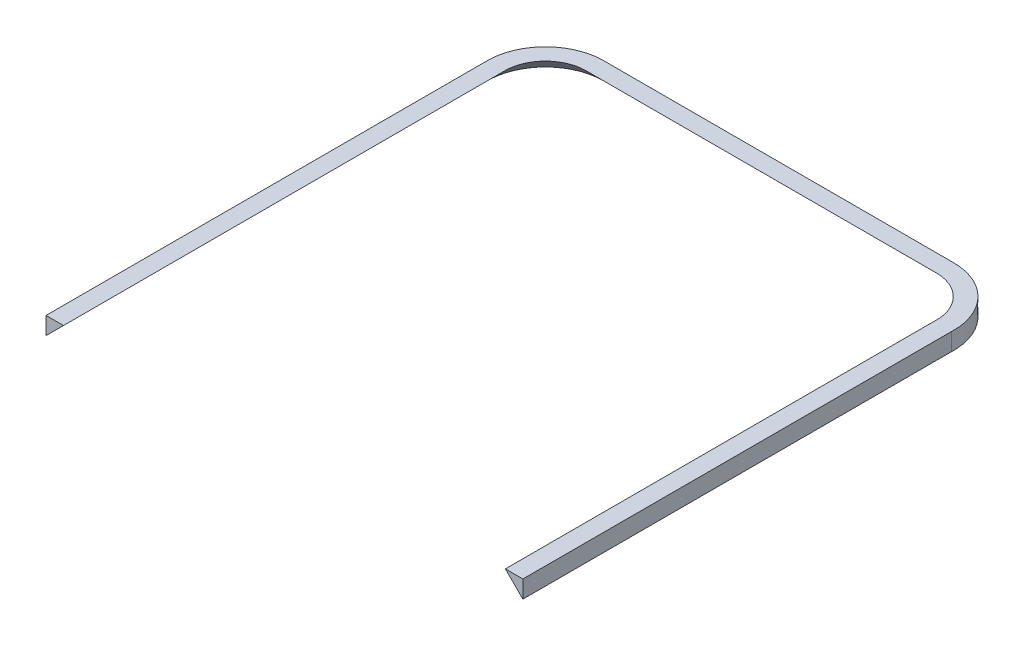
ISO-10303-21;
HEADER;
FILE_DESCRIPTION(('STEP AP214'),'2;1');
FILE_NAME('part.step','',(''),(''),'','','');
FILE_SCHEMA(('AUTOMOTIVE_DESIGN { 1 0 10303 214 1 1 1 1 }'));
ENDSEC;
DATA;
#1=APPLICATION_CONTEXT('core data for automotive mechanical design processes');
#2=APPLICATION_PROTOCOL_DEFINITION('international standard','automotive_design',2000,#1);
#3=PRODUCT_CONTEXT('',#1,'mechanical');
#4=PRODUCT('Part','Part','',(#3));
#5=PRODUCT_RELATED_PRODUCT_CATEGORY('part','',(#4));
#6=PRODUCT_DEFINITION_FORMATION('','',#4);
#7=PRODUCT_DEFINITION_CONTEXT('part definition',#1,'design');
#8=PRODUCT_DEFINITION('design','',#6,#7);
#9=PRODUCT_DEFINITION_SHAPE('','',#8);
#10=(LENGTH_UNIT() NAMED_UNIT(*) SI_UNIT(.MILLI.,.METRE.));
#11=(NAMED_UNIT(*) PLANE_ANGLE_UNIT() SI_UNIT($,.RADIAN.));
#12=(NAMED_UNIT(*) SI_UNIT($,.STERADIAN.) SOLID_ANGLE_UNIT());
#13=UNCERTAINTY_MEASURE_WITH_UNIT(LENGTH_MEASURE(1.E-05),#10,'distance_accuracy_value','');
#14=(GEOMETRIC_REPRESENTATION_CONTEXT(3) GLOBAL_UNCERTAINTY_ASSIGNED_CONTEXT((#13)) GLOBAL_UNIT_ASSIGNED_CONTEXT((#10,
#11,#12)) REPRESENTATION_CONTEXT('',''));
#15=CARTESIAN_POINT('',(0.,0.,0.));
#16=DIRECTION('',(0.,0.,1.));
#17=DIRECTION('',(1.,0.,0.));
#18=AXIS2_PLACEMENT_3D('',#15,#16,#17);
#19=CARTESIAN_POINT('',(60.0000000072265,-140.1,-167.746827861585));
#20=DIRECTION('',(0.,1.52655665885959E-13,-1.));
#21=DIRECTION('',(0.,1.,1.52655665885959E-13));
#22=AXIS2_PLACEMENT_3D('',#19,#20,#21);
#23=PLANE('',#22);
#24=DIRECTION('',(0.,-1.,-1.52655665885959E-13));
#25=VECTOR('',#24,1.);
#26=CARTESIAN_POINT('',(60.0000000072265,-140.1,-167.746827861585));
#27=LINE('',#26,#25);
#28=CARTESIAN_POINT('',(60.0000000072265,-137.1,-167.746827861585));
#29=VERTEX_POINT('',#28);
#30=CARTESIAN_POINT('',(60.0000000072265,-143.1,-167.746827861586));
#31=VERTEX_POINT('',#30);
#32=EDGE_CURVE('E218',#29,#31,#27,.T.);
#33=ORIENTED_EDGE('',*,*,#32,.T.);
#34=DIRECTION('',(-1.,0.,0.));
#35=VECTOR('',#34,1.);
#36=CARTESIAN_POINT('',(60.0000000072265,-143.1,-167.746827861586));
#37=LINE('',#36,#35);
#38=CARTESIAN_POINT('',(-60.0000000072264,-143.1,-167.746827861586));
#39=VERTEX_POINT('',#38);
#40=EDGE_CURVE('E93',#31,#39,#37,.T.);
#41=ORIENTED_EDGE('',*,*,#40,.T.);
#42=DIRECTION('',(0.,-1.,-1.52655665885959E-13));
#43=VECTOR('',#42,1.);
#44=CARTESIAN_POINT('',(-60.0000000072264,-140.1,-167.746827861585));
#45=LINE('',#44,#43);
#46=CARTESIAN_POINT('',(-60.0000000072264,-137.1,-167.746827861585));
#47=VERTEX_POINT('',#46);
#48=EDGE_CURVE('E101',#47,#39,#45,.T.);
#49=ORIENTED_EDGE('',*,*,#48,.F.);
#50=DIRECTION('',(-1.,0.,0.));
#51=VECTOR('',#50,1.);
#52=CARTESIAN_POINT('',(60.0000000072265,-137.1,-167.746827861585));
#53=LINE('',#52,#51);
#54=EDGE_CURVE('E12',#29,#47,#53,.T.);
#55=ORIENTED_EDGE('',*,*,#54,.F.);
#56=EDGE_LOOP('',(#33,#41,#49,#55));
#57=FACE_BOUND('',#56,.T.);
#58=ADVANCED_FACE('F83',(#57),#23,.T.);
#59=CARTESIAN_POINT('',(60.0026904539942,-140.1,-164.746829068003));
#60=DIRECTION('',(0.,-0.707106639008926,0.70710692336414));
#61=DIRECTION('',(0.,-0.70710692336414,-0.707106639008926));
#62=AXIS2_PLACEMENT_3D('',#59,#60,#61);
#63=PLANE('',#62);
#64=DIRECTION('',(0.000634144384634329,0.707106781186455,0.707106496831298));
#65=VECTOR('',#64,1.);
#66=CARTESIAN_POINT('',(60.0026904539942,-140.1,-164.746829068003));
#67=LINE('',#66,#65);
#68=CARTESIAN_POINT('',(60.005380900762,-137.100000000001,-161.74683027442));
#69=VERTEX_POINT('',#68);
#70=EDGE_CURVE('E210',#31,#69,#67,.T.);
#71=ORIENTED_EDGE('',*,*,#70,.T.);
#72=DIRECTION('',(-1.,0.,0.));
#73=VECTOR('',#72,1.);
#74=CARTESIAN_POINT('',(60.005380900762,-137.100000000001,-161.74683027442));
#75=LINE('',#74,#73);
#76=CARTESIAN_POINT('',(-59.9946191136909,-137.100000000001,-161.74683027442));
#77=VERTEX_POINT('',#76);
#78=EDGE_CURVE('E108',#69,#77,#75,.T.);
#79=ORIENTED_EDGE('',*,*,#78,.T.);
#80=DIRECTION('',(0.000634144384634329,0.707106781186455,0.707106496831298));
#81=VECTOR('',#80,1.);
#82=CARTESIAN_POINT('',(-59.9973095604586,-140.1,-164.746829068003));
#83=LINE('',#82,#81);
#84=EDGE_CURVE('E227',#39,#77,#83,.T.);
#85=ORIENTED_EDGE('',*,*,#84,.F.);
#86=ORIENTED_EDGE('',*,*,#40,.F.);
#87=EDGE_LOOP('',(#71,#79,#85,#86));
#88=FACE_BOUND('',#87,.T.);
#89=ADVANCED_FACE('F283',(#88),#63,.T.);
#90=CARTESIAN_POINT('',(0.,0.,0.));
#91=DIRECTION('',(0.,0.,1.));
#92=DIRECTION('',(1.,0.,0.));
#93=AXIS2_PLACEMENT_3D('',#90,#91,#92);
#94=PLANE('',#93);
#95=DIRECTION('',(0.,1.,0.));
#96=VECTOR('',#95,1.);
#97=CARTESIAN_POINT('',(80.0000000000001,-143.1,0.));
#98=LINE('',#97,#96);
#99=CARTESIAN_POINT('',(80.0000000000001,-143.1,0.));
#100=VERTEX_POINT('',#99);
#101=CARTESIAN_POINT('',(80.0000000000001,-137.1,0.));
#102=VERTEX_POINT('',#101);
#103=EDGE_CURVE('E229',#100,#102,#98,.T.);
#104=ORIENTED_EDGE('',*,*,#103,.T.);
#105=DIRECTION('',(-1.,0.,0.));
#106=VECTOR('',#105,1.);
#107=CARTESIAN_POINT('',(80.0000000000001,-137.1,0.));
#108=LINE('',#107,#106);
#109=CARTESIAN_POINT('',(74.0000000000001,-137.1,0.));
#110=VERTEX_POINT('',#109);
#111=EDGE_CURVE('E232',#102,#110,#108,.T.);
#112=ORIENTED_EDGE('',*,*,#111,.T.);
#113=DIRECTION('',(0.707106781186549,-0.707106781186546,0.));
#114=VECTOR('',#113,1.);
#115=CARTESIAN_POINT('',(74.0000000000001,-137.1,0.));
#116=LINE('',#115,#114);
#117=EDGE_CURVE('E236',#110,#100,#116,.T.);
#118=ORIENTED_EDGE('',*,*,#117,.T.);
#119=EDGE_LOOP('',(#104,#112,#118));
#120=FACE_BOUND('',#119,.T.);
#121=ADVANCED_FACE('F274',(#120),#94,.T.);
#122=CARTESIAN_POINT('',(80.0000000000001,-143.1,-155.44882255944));
#123=DIRECTION('',(1.,0.,0.));
#124=DIRECTION('',(0.,0.,-1.));
#125=AXIS2_PLACEMENT_3D('',#122,#123,#124);
#126=PLANE('',#125);
#127=DIRECTION('',(0.,0.,1.));
#128=VECTOR('',#127,1.);
#129=CARTESIAN_POINT('',(80.0000000000001,-143.1,-155.44882255944));
#130=LINE('',#129,#128);
#131=CARTESIAN_POINT('',(80.,-143.1,-146.9));
#132=VERTEX_POINT('',#131);
#133=EDGE_CURVE('E240',#132,#100,#130,.T.);
#134=ORIENTED_EDGE('',*,*,#133,.F.);
#135=DIRECTION('',(0.,1.,0.));
#136=VECTOR('',#135,1.);
#137=CARTESIAN_POINT('',(80.0000000000001,-143.1,-146.9));
#138=LINE('',#137,#136);
#139=CARTESIAN_POINT('',(80.0000000000001,-137.1,-146.9));
#140=VERTEX_POINT('',#139);
#141=EDGE_CURVE('E228',#132,#140,#138,.T.);
#142=ORIENTED_EDGE('',*,*,#141,.T.);
#143=DIRECTION('',(0.,0.,1.));
#144=VECTOR('',#143,1.);
#145=CARTESIAN_POINT('',(80.0000000000001,-137.1,-155.44882255944));
#146=LINE('',#145,#144);
#147=EDGE_CURVE('E239',#140,#102,#146,.T.);
#148=ORIENTED_EDGE('',*,*,#147,.T.);
#149=ORIENTED_EDGE('',*,*,#103,.F.);
#150=EDGE_LOOP('',(#134,#142,#148,#149));
#151=FACE_BOUND('',#150,.T.);
#152=ADVANCED_FACE('F282',(#151),#126,.T.);
#153=CARTESIAN_POINT('',(80.0000000000001,-137.1,-155.44882255944));
#154=DIRECTION('',(0.,1.,0.));
#155=DIRECTION('',(-1.,0.,0.));
#156=AXIS2_PLACEMENT_3D('',#153,#154,#155);
#157=PLANE('',#156);
#158=ORIENTED_EDGE('',*,*,#147,.F.);
#159=CARTESIAN_POINT('',(60.0000000072265,-137.1,-167.746827861585));
#160=CARTESIAN_POINT('',(61.0592730116099,-137.1,-167.747777834511));
#161=CARTESIAN_POINT('',(63.2556865835091,-137.1,-167.57602128154));
#162=CARTESIAN_POINT('',(65.8173717183723,-137.1,-166.936302463394));
#163=CARTESIAN_POINT('',(67.2357184913963,-137.1,-166.401870902081));
#164=CARTESIAN_POINT('',(68.3455869653419,-137.1,-165.951479904861));
#165=CARTESIAN_POINT('',(70.237445342187,-137.1,-165.031233798682));
#166=CARTESIAN_POINT('',(72.5641588009194,-137.1,-163.409734829044));
#167=CARTESIAN_POINT('',(73.9772517454454,-137.1,-162.085738994952));
#168=CARTESIAN_POINT('',(74.8600185414015,-137.1,-161.165594622758));
#169=CARTESIAN_POINT('',(76.0894150837394,-137.1,-159.759627029486));
#170=CARTESIAN_POINT('',(77.6423952489026,-137.1,-157.382391913259));
#171=CARTESIAN_POINT('',(78.5300473211552,-137.1,-155.374330079866));
#172=CARTESIAN_POINT('',(78.9413975112569,-137.1,-154.226246970426));
#173=CARTESIAN_POINT('',(79.4149226919487,-137.1,-152.808078689597));
#174=CARTESIAN_POINT('',(79.9604727680127,-137.1,-150.220814021999));
#175=CARTESIAN_POINT('',(80.0456670211899,-137.1,-147.977565701724));
#176=CARTESIAN_POINT('',(80.,-137.1,-146.9));
#177=B_SPLINE_CURVE_WITH_KNOTS('',3,(#159,#160,#161,#162,#163,#164,#165,#166,#167,#168,#169,
#170,#171,#172,#173,#174,#175,#176),.UNSPECIFIED.,.F.,.F.,(4,1,1,2,1,1,2,1,1,2,1,1,4),(0.,0.11,
0.220000000000015,0.25,0.33,0.439999999999999,0.5,0.551999999999999,0.664,0.75,
0.775999999999996,0.887999999999999,1.),.UNSPECIFIED.);
#178=EDGE_CURVE('E233',#140,#29,#177,.F.);
#179=ORIENTED_EDGE('',*,*,#178,.T.);
#180=ORIENTED_EDGE('',*,*,#54,.T.);
#181=CARTESIAN_POINT('',(-80.,-137.1,-146.9));
#182=CARTESIAN_POINT('',(-80.0448515386686,-137.1,-147.95832345705));
#183=CARTESIAN_POINT('',(-79.9642746115225,-137.1,-150.159968353741));
#184=CARTESIAN_POINT('',(-79.431276473459,-137.1,-152.745966010602));
#185=CARTESIAN_POINT('',(-78.9560885894748,-137.1,-154.185244002231));
#186=CARTESIAN_POINT('',(-78.552083938482,-137.1,-155.312825627575));
#187=CARTESIAN_POINT('',(-77.7110380703779,-137.1,-157.241198740258));
#188=CARTESIAN_POINT('',(-76.1873647891442,-137.1,-159.6331172505));
#189=CARTESIAN_POINT('',(-74.9230733125412,-137.1,-161.099870024744));
#190=CARTESIAN_POINT('',(-74.0403065165851,-137.1,-162.020014396938));
#191=CARTESIAN_POINT('',(-72.6865002763603,-137.1,-163.306625991621));
#192=CARTESIAN_POINT('',(-70.3756722412904,-137.1,-164.956798098871));
#193=CARTESIAN_POINT('',(-68.4061252457389,-137.1,-165.926913123194));
#194=CARTESIAN_POINT('',(-67.2760773449942,-137.1,-166.385493047637));
#195=CARTESIAN_POINT('',(-65.8787532323457,-137.1,-166.917388426174));
#196=CARTESIAN_POINT('',(-63.3163224001143,-137.1,-167.569700909363));
#197=CARTESIAN_POINT('',(-61.0785325207805,-137.1,-167.747795106746));
#198=CARTESIAN_POINT('',(-60.0000000072264,-137.1,-167.746827861585));
#199=B_SPLINE_CURVE_WITH_KNOTS('',3,(#181,#182,#183,#184,#185,#186,#187,#188,#189,#190,#191,
#192,#193,#194,#195,#196,#197,#198),.UNSPECIFIED.,.F.,.F.,(4,1,1,2,1,1,2,1,1,2,1,1,4),(0.,0.11,
0.220000000000016,0.25,0.330000000000001,0.44,0.5,0.552000000000001,0.664,0.75,
0.775999999999996,0.888,1.),.UNSPECIFIED.);
#200=CARTESIAN_POINT('',(-80.,-137.1,-146.9));
#201=VERTEX_POINT('',#200);
#202=EDGE_CURVE('E223',#47,#201,#199,.F.);
#203=ORIENTED_EDGE('',*,*,#202,.T.);
#204=DIRECTION('',(0.,0.,1.));
#205=VECTOR('',#204,1.);
#206=CARTESIAN_POINT('',(-80.,-137.1,-71.6994811544757));
#207=LINE('',#206,#205);
#208=CARTESIAN_POINT('',(-80.,-137.1,3.50103769104848));
#209=VERTEX_POINT('',#208);
#210=EDGE_CURVE('E182',#201,#209,#207,.T.);
#211=ORIENTED_EDGE('',*,*,#210,.T.);
#212=DIRECTION('',(-1.,2.5441603495373E-13,0.));
#213=VECTOR('',#212,1.);
#214=CARTESIAN_POINT('',(-76.9998812002215,-137.100000000001,3.50103769104848));
#215=LINE('',#214,#213);
#216=CARTESIAN_POINT('',(-73.9997624004429,-137.100000000002,3.50103769104848));
#217=VERTEX_POINT('',#216);
#218=EDGE_CURVE('E161',#217,#209,#215,.T.);
#219=ORIENTED_EDGE('',*,*,#218,.F.);
#220=DIRECTION('',(0.,0.,1.));
#221=VECTOR('',#220,1.);
#222=CARTESIAN_POINT('',(-73.9997624004429,-137.100000000002,-71.7630248559038));
#223=LINE('',#222,#221);
#224=CARTESIAN_POINT('',(-73.9997624004429,-137.100000000002,-147.027087402856));
#225=VERTEX_POINT('',#224);
#226=EDGE_CURVE('E166',#225,#217,#223,.T.);
#227=ORIENTED_EDGE('',*,*,#226,.F.);
#228=CARTESIAN_POINT('',(-59.9946191136909,-137.100000000001,-161.74683027442));
#229=CARTESIAN_POINT('',(-60.7435588770522,-137.100000000001,-161.747501935545));
#230=CARTESIAN_POINT('',(-62.3310515772398,-137.100000000001,-161.623875334491));
#231=CARTESIAN_POINT('',(-64.1433536764462,-137.100000000001,-161.158092547374));
#232=CARTESIAN_POINT('',(-65.1213437419744,-137.100000000001,-160.785487649153));
#233=CARTESIAN_POINT('',(-65.9117279926251,-137.100000000001,-160.464129512737));
#234=CARTESIAN_POINT('',(-67.2846893079076,-137.100000000001,-159.78304733045));
#235=CARTESIAN_POINT('',(-68.936227248209,-137.100000000001,-158.595144806613));
#236=CARTESIAN_POINT('',(-69.8779139704582,-137.100000000001,-157.696828556505));
#237=CARTESIAN_POINT('',(-70.4903000818593,-137.100000000001,-157.053307803813));
#238=CARTESIAN_POINT('',(-71.3635743912433,-137.100000000001,-156.026476933539));
#239=CARTESIAN_POINT('',(-72.449015650193,-137.100000000001,-154.306347215857));
#240=CARTESIAN_POINT('',(-73.0279534186157,-137.1,-152.957331825431));
#241=CARTESIAN_POINT('',(-73.3043619677156,-137.1,-152.166852902864));
#242=CARTESIAN_POINT('',(-73.6286812798782,-137.1,-151.15741895468));
#243=CARTESIAN_POINT('',(-73.9985504621025,-137.100000000002,-149.323201985324));
#244=CARTESIAN_POINT('',(-74.0309152346886,-137.100000000001,-147.762174229629));
#245=CARTESIAN_POINT('',(-73.9997624004429,-137.100000000002,-147.027087402856));
#246=B_SPLINE_CURVE_WITH_KNOTS('',3,(#228,#229,#230,#231,#232,#233,#234,#235,#236,#237,#238,
#239,#240,#241,#242,#243,#244,#245),.UNSPECIFIED.,.F.,.F.,(4,1,1,2,1,1,2,1,1,2,1,1,4),(0.,0.112,
0.224000000000004,0.25,0.336,0.447999999999999,0.5,0.56,0.669999999999999,0.75,
0.779999999999984,0.89,1.),.UNSPECIFIED.);
#247=EDGE_CURVE('E184',#77,#225,#246,.T.);
#248=ORIENTED_EDGE('',*,*,#247,.F.);
#249=ORIENTED_EDGE('',*,*,#78,.F.);
#250=CARTESIAN_POINT('',(74.,-137.1,-147.027082370404));
#251=CARTESIAN_POINT('',(74.0316957067021,-137.1,-147.774978894945));
#252=CARTESIAN_POINT('',(73.9964290934892,-137.099999999999,-149.365513339228));
#253=CARTESIAN_POINT('',(73.6186402402946,-137.100000000001,-151.197961563791));
#254=CARTESIAN_POINT('',(73.2952484052159,-137.100000000002,-152.192993936201));
#255=CARTESIAN_POINT('',(73.0138481335984,-137.100000000002,-152.998159620444));
#256=CARTESIAN_POINT('',(72.4033089274446,-137.100000000002,-154.402899971809));
#257=CARTESIAN_POINT('',(71.298921097086,-137.1,-156.110462769338));
#258=CARTESIAN_POINT('',(70.4494823311827,-137.1,-157.095858292449));
#259=CARTESIAN_POINT('',(69.8379074264008,-137.1,-157.73962502028));
#260=CARTESIAN_POINT('',(68.8569510445276,-137.1,-158.663108001515));
#261=CARTESIAN_POINT('',(67.193541551146,-137.100000000001,-159.83187582619));
#262=CARTESIAN_POINT('',(65.8760949309519,-137.100000000001,-160.478449707054));
#263=CARTESIAN_POINT('',(65.1009817549533,-137.1,-160.79414779617));
#264=CARTESIAN_POINT('',(64.1097377153145,-137.1,-161.168486725297));
#265=CARTESIAN_POINT('',(62.2972139439145,-137.100000000001,-161.626605855492));
#266=CARTESIAN_POINT('',(60.7407180769801,-137.100000000001,-161.747489736528));
#267=CARTESIAN_POINT('',(60.005380900762,-137.100000000001,-161.74683027442));
#268=B_SPLINE_CURVE_WITH_KNOTS('',3,(#250,#251,#252,#253,#254,#255,#256,#257,#258,#259,#260,
#261,#262,#263,#264,#265,#266,#267),.UNSPECIFIED.,.F.,.F.,(4,1,1,2,1,1,2,1,1,2,1,1,4),(0.,
0.112000000000001,0.224000000000004,0.25,0.336,0.448000000000001,0.5,0.560000000000001,0.67,
0.75,0.779999999999985,0.89,1.),.UNSPECIFIED.);
#269=CARTESIAN_POINT('',(74.,-137.1,-147.027082370404));
#270=VERTEX_POINT('',#269);
#271=EDGE_CURVE('E204',#270,#69,#268,.T.);
#272=ORIENTED_EDGE('',*,*,#271,.F.);
#273=DIRECTION('',(0.,0.,1.));
#274=VECTOR('',#273,1.);
#275=CARTESIAN_POINT('',(74.0000000000001,-137.1,-155.44882255944));
#276=LINE('',#275,#274);
#277=EDGE_CURVE('E242',#270,#110,#276,.T.);
#278=ORIENTED_EDGE('',*,*,#277,.T.);
#279=ORIENTED_EDGE('',*,*,#111,.F.);
#280=EDGE_LOOP('',(#158,#179,#180,#203,#211,#219,#227,#248,#249,#272,#278,#279));
#281=FACE_BOUND('',#280,.T.);
#282=ADVANCED_FACE('F179',(#281),#157,.T.);
#283=CARTESIAN_POINT('',(74.0000000000001,-137.1,-155.44882255944));
#284=DIRECTION('',(-0.707106781186546,-0.707106781186549,0.));
#285=DIRECTION('',(0.707106781186549,-0.707106781186546,0.));
#286=AXIS2_PLACEMENT_3D('',#283,#284,#285);
#287=PLANE('',#286);
#288=ORIENTED_EDGE('',*,*,#277,.F.);
#289=DIRECTION('',(0.707027490884781,-0.707027490884778,0.0149751215803713));
#290=VECTOR('',#289,1.);
#291=CARTESIAN_POINT('',(73.9108321085865,-137.010832108586,-147.028970981571));
#292=LINE('',#291,#290);
#293=EDGE_CURVE('E224',#270,#132,#292,.T.);
#294=ORIENTED_EDGE('',*,*,#293,.T.);
#295=ORIENTED_EDGE('',*,*,#133,.T.);
#296=ORIENTED_EDGE('',*,*,#117,.F.);
#297=EDGE_LOOP('',(#288,#294,#295,#296));
#298=FACE_BOUND('',#297,.T.);
#299=ADVANCED_FACE('F270',(#298),#287,.T.);
#300=CARTESIAN_POINT('',(80.,-137.1,-146.9));
#301=CARTESIAN_POINT('',(80.0456670211899,-137.1,-147.977565701724));
#302=CARTESIAN_POINT('',(79.9604727680127,-137.1,-150.220814021999));
#303=CARTESIAN_POINT('',(79.4149226919487,-137.1,-152.808078689597));
#304=CARTESIAN_POINT('',(78.9413975112569,-137.1,-154.226246970426));
#305=CARTESIAN_POINT('',(78.5300473211552,-137.1,-155.374330079866));
#306=CARTESIAN_POINT('',(77.6423952489026,-137.1,-157.382391913259));
#307=CARTESIAN_POINT('',(76.0894150837394,-137.1,-159.759627029486));
#308=CARTESIAN_POINT('',(74.8600185414015,-137.1,-161.165594622758));
#309=CARTESIAN_POINT('',(73.9772517454454,-137.1,-162.085738994952));
#310=CARTESIAN_POINT('',(72.5641588009194,-137.1,-163.409734829044));
#311=CARTESIAN_POINT('',(70.237445342187,-137.1,-165.031233798682));
#312=CARTESIAN_POINT('',(68.3455869653419,-137.1,-165.951479904861));
#313=CARTESIAN_POINT('',(67.2357184913963,-137.1,-166.401870902081));
#314=CARTESIAN_POINT('',(65.8173717183723,-137.1,-166.936302463394));
#315=CARTESIAN_POINT('',(63.2556865835091,-137.1,-167.57602128154));
#316=CARTESIAN_POINT('',(61.0592730116099,-137.1,-167.747777834511));
#317=CARTESIAN_POINT('',(60.0000000072265,-137.1,-167.746827861585));
#318=CARTESIAN_POINT('',(80.,-139.1,-146.9));
#319=CARTESIAN_POINT('',(80.0482272823669,-139.1,-148.037977998385));
#320=CARTESIAN_POINT('',(79.959287554644,-139.1,-150.192776573027));
#321=CARTESIAN_POINT('',(79.4148483925628,-139.1,-152.806492189569));
#322=CARTESIAN_POINT('',(78.9414690582747,-139.1,-154.227855904951));
#323=CARTESIAN_POINT('',(78.5301848504201,-139.1,-155.377301749968));
#324=CARTESIAN_POINT('',(77.6423430976646,-139.1,-157.380576383618));
#325=CARTESIAN_POINT('',(76.0893057737251,-139.1,-159.759710798141));
#326=CARTESIAN_POINT('',(74.8601355238406,-139.1,-161.165767356588));
#327=CARTESIAN_POINT('',(73.9774378284311,-139.1,-162.085869604291));
#328=CARTESIAN_POINT('',(72.5643001301781,-139.1,-163.40962131601));
#329=CARTESIAN_POINT('',(70.2356969918416,-139.1,-165.031253719463));
#330=CARTESIAN_POINT('',(68.3482951477138,-139.1,-165.951494030757));
#331=CARTESIAN_POINT('',(67.2374944329063,-139.1,-166.4018764138));
#332=CARTESIAN_POINT('',(65.8162848280176,-139.1,-166.936294501521));
#333=CARTESIAN_POINT('',(63.2281369657551,-139.1,-167.575999474923));
#334=CARTESIAN_POINT('',(61.1186346647607,-139.1,-167.747831070988));
#335=CARTESIAN_POINT('',(60.0000000072265,-139.1,-167.746827861585));
#336=CARTESIAN_POINT('',(80.,-141.1,-146.9));
#337=CARTESIAN_POINT('',(80.0476445493621,-141.1,-148.024227745297));
#338=CARTESIAN_POINT('',(79.9595573173355,-141.1,-150.199158088722));
#339=CARTESIAN_POINT('',(79.4148653036132,-141.1,-152.806853287857));
#340=CARTESIAN_POINT('',(78.9414527736834,-141.1,-154.227489700417));
#341=CARTESIAN_POINT('',(78.5301535478168,-141.1,-155.37662537747));
#342=CARTESIAN_POINT('',(77.6423549676446,-141.1,-157.380989610618));
#343=CARTESIAN_POINT('',(76.089330653434,-141.1,-159.75969173182));
#344=CARTESIAN_POINT('',(74.860108897835,-141.1,-161.165728041184));
#345=CARTESIAN_POINT('',(73.9773954746672,-141.1,-162.085839876709));
#346=CARTESIAN_POINT('',(72.5642679626696,-141.1,-163.409647152355));
#347=CARTESIAN_POINT('',(70.2360949283723,-141.1,-165.031249185357));
#348=CARTESIAN_POINT('',(68.3476787468307,-141.1,-165.951490815607));
#349=CARTESIAN_POINT('',(67.2370902164375,-141.1,-166.401875159295));
#350=CARTESIAN_POINT('',(65.8165322117174,-141.1,-166.936296313698));
#351=CARTESIAN_POINT('',(63.2344074477188,-141.1,-167.576004438259));
#352=CARTESIAN_POINT('',(61.1051235453419,-141.1,-167.747818954001));
#353=CARTESIAN_POINT('',(60.0000000072265,-141.1,-167.746827861585));
#354=CARTESIAN_POINT('',(80.,-143.1,-146.9));
#355=CARTESIAN_POINT('',(80.0456670211899,-143.1,-147.977565701724));
#356=CARTESIAN_POINT('',(79.9604727680114,-143.1,-150.220814021999));
#357=CARTESIAN_POINT('',(79.4149226919499,-143.1,-152.808078689597));
#358=CARTESIAN_POINT('',(78.9413975112585,-143.1,-154.226246970426));
#359=CARTESIAN_POINT('',(78.530047321157,-143.1,-155.374330079867));
#360=CARTESIAN_POINT('',(77.6423952489039,-143.1,-157.38239191326));
#361=CARTESIAN_POINT('',(76.0894150837391,-143.1,-159.759627029486));
#362=CARTESIAN_POINT('',(74.8600185414013,-143.1,-161.165594622758));
#363=CARTESIAN_POINT('',(73.9772517454454,-143.1,-162.085738994952));
#364=CARTESIAN_POINT('',(72.5641588009198,-143.1,-163.409734829044));
#365=CARTESIAN_POINT('',(70.2374453421875,-143.1,-165.031233798683));
#366=CARTESIAN_POINT('',(68.3455869653422,-143.1,-165.951479904861));
#367=CARTESIAN_POINT('',(67.2357184913965,-143.1,-166.401870902081));
#368=CARTESIAN_POINT('',(65.8173717183725,-143.1,-166.936302463395));
#369=CARTESIAN_POINT('',(63.2556865835093,-143.1,-167.576021281541));
#370=CARTESIAN_POINT('',(61.05927301161,-143.1,-167.747777834511));
#371=CARTESIAN_POINT('',(60.0000000072265,-143.1,-167.746827861586));
#372=B_SPLINE_SURFACE_WITH_KNOTS('',3,3,((#300,#301,#302,#303,#304,#305,#306,#307,#308,#309,
#310,#311,#312,#313,#314,#315,#316,#317),(#318,#319,#320,#321,#322,#323,#324,#325,#326,#327,
#328,#329,#330,#331,#332,#333,#334,#335),(#336,#337,#338,#339,#340,#341,#342,#343,#344,#345,
#346,#347,#348,#349,#350,#351,#352,#353),(#354,#355,#356,#357,#358,#359,#360,#361,#362,#363,
#364,#365,#366,#367,#368,#369,#370,#371)),.UNSPECIFIED.,.F.,.F.,.F.,(4,4),(4,1,1,2,1,1,2,1,1,2,
1,1,4),(0.292926059328082,0.585786436101607),(0.,0.112000000000001,0.224000000000004,0.25,0.336,
0.448000000000001,0.5,0.560000000000001,0.67,0.75,0.779999999999985,0.89,1.),.UNSPECIFIED.);
#373=CARTESIAN_POINT('',(80.,-143.1,-146.9));
#374=CARTESIAN_POINT('',(80.0456670211899,-143.1,-147.977565701724));
#375=CARTESIAN_POINT('',(79.9604727680114,-143.1,-150.220814021999));
#376=CARTESIAN_POINT('',(79.4149226919499,-143.1,-152.808078689597));
#377=CARTESIAN_POINT('',(78.9413975112585,-143.1,-154.226246970426));
#378=CARTESIAN_POINT('',(78.530047321157,-143.1,-155.374330079867));
#379=CARTESIAN_POINT('',(77.6423952489039,-143.1,-157.38239191326));
#380=CARTESIAN_POINT('',(76.0894150837391,-143.1,-159.759627029486));
#381=CARTESIAN_POINT('',(74.8600185414013,-143.1,-161.165594622758));
#382=CARTESIAN_POINT('',(73.9772517454454,-143.1,-162.085738994952));
#383=CARTESIAN_POINT('',(72.5641588009198,-143.1,-163.409734829044));
#384=CARTESIAN_POINT('',(70.2374453421875,-143.1,-165.031233798683));
#385=CARTESIAN_POINT('',(68.3455869653422,-143.1,-165.951479904861));
#386=CARTESIAN_POINT('',(67.2357184913965,-143.1,-166.401870902081));
#387=CARTESIAN_POINT('',(65.8173717183725,-143.1,-166.936302463395));
#388=CARTESIAN_POINT('',(63.2556865835093,-143.1,-167.576021281541));
#389=CARTESIAN_POINT('',(61.05927301161,-143.1,-167.747777834511));
#390=CARTESIAN_POINT('',(60.0000000072265,-143.1,-167.746827861586));
#391=B_SPLINE_CURVE_WITH_KNOTS('',3,(#373,#374,#375,#376,#377,#378,#379,#380,#381,#382,#383,
#384,#385,#386,#387,#388,#389,#390),.UNSPECIFIED.,.F.,.F.,(4,1,1,2,1,1,2,1,1,2,1,1,4),(0.,
0.112000000000001,0.224000000000004,0.25,0.336,0.448000000000001,0.5,0.560000000000001,0.67,
0.75,0.779999999999985,0.89,1.),.UNSPECIFIED.);
#392=EDGE_CURVE('E209',#132,#31,#391,.T.);
#393=ORIENTED_EDGE('',*,*,#141,.F.);
#394=ORIENTED_EDGE('',*,*,#392,.T.);
#395=ORIENTED_EDGE('',*,*,#32,.F.);
#396=ORIENTED_EDGE('',*,*,#178,.F.);
#397=EDGE_LOOP('',(#393,#394,#395,#396));
#398=FACE_BOUND('',#397,.T.);
#399=ADVANCED_FACE('F257',(#398),#372,.T.);
#400=CARTESIAN_POINT('',(80.,-143.1,-146.9));
#401=CARTESIAN_POINT('',(80.0456670211899,-143.1,-147.977565701724));
#402=CARTESIAN_POINT('',(79.9604727680114,-143.1,-150.220814021999));
#403=CARTESIAN_POINT('',(79.4149226919499,-143.1,-152.808078689597));
#404=CARTESIAN_POINT('',(78.9413975112585,-143.1,-154.226246970426));
#405=CARTESIAN_POINT('',(78.530047321157,-143.1,-155.374330079867));
#406=CARTESIAN_POINT('',(77.6423952489039,-143.1,-157.38239191326));
#407=CARTESIAN_POINT('',(76.0894150837391,-143.1,-159.759627029486));
#408=CARTESIAN_POINT('',(74.8600185414013,-143.1,-161.165594622758));
#409=CARTESIAN_POINT('',(73.9772517454454,-143.1,-162.085738994952));
#410=CARTESIAN_POINT('',(72.5641588009198,-143.1,-163.409734829044));
#411=CARTESIAN_POINT('',(70.2374453421875,-143.1,-165.031233798683));
#412=CARTESIAN_POINT('',(68.3455869653422,-143.1,-165.951479904861));
#413=CARTESIAN_POINT('',(67.2357184913965,-143.1,-166.401870902081));
#414=CARTESIAN_POINT('',(65.8173717183725,-143.1,-166.936302463395));
#415=CARTESIAN_POINT('',(63.2556865835093,-143.1,-167.576021281541));
#416=CARTESIAN_POINT('',(61.05927301161,-143.1,-167.747777834511));
#417=CARTESIAN_POINT('',(60.0000000072265,-143.1,-167.746827861586));
#418=CARTESIAN_POINT('',(78.,-141.1,-146.942360790134));
#419=CARTESIAN_POINT('',(78.0428700603959,-141.1,-147.953928996464));
#420=CARTESIAN_POINT('',(77.9715970994173,-141.1,-149.915343336137));
#421=CARTESIAN_POINT('',(77.4827745595773,-141.1,-152.270220317903));
#422=CARTESIAN_POINT('',(77.0593997913462,-141.100000000001,-153.549664921773));
#423=CARTESIAN_POINT('',(76.6914141797873,-141.100000000001,-154.584432311044));
#424=CARTESIAN_POINT('',(75.8959952515481,-141.100000000001,-156.387908869447));
#425=CARTESIAN_POINT('',(74.4925043362498,-141.1,-158.543299804437));
#426=CARTESIAN_POINT('',(73.3899247976259,-141.1,-159.809141344827));
#427=CARTESIAN_POINT('',(72.5976055033597,-141.1,-160.637129230243));
#428=CARTESIAN_POINT('',(71.3285255641377,-141.1,-161.827443414248));
#429=CARTESIAN_POINT('',(69.2215404906011,-141.1,-163.298128947855));
#430=CARTESIAN_POINT('',(67.5243905692654,-141.1,-164.127146768686));
#431=CARTESIAN_POINT('',(66.5254298800339,-141.1,-164.532633871288));
#432=CARTESIAN_POINT('',(65.2473707096583,-141.1,-165.013691432706));
#433=CARTESIAN_POINT('',(62.9161796765293,-141.1,-165.59286696271));
#434=CARTESIAN_POINT('',(60.996216924322,-141.1,-165.747720480528));
#435=CARTESIAN_POINT('',(60.001793638405,-141.1,-165.746828665864));
#436=CARTESIAN_POINT('',(76.,-139.1,-146.984721580269));
#437=CARTESIAN_POINT('',(76.037282883549,-139.1,-147.864453945705));
#438=CARTESIAN_POINT('',(75.9840130964532,-139.099999999999,-149.640428337683));
#439=CARTESIAN_POINT('',(75.5507073999359,-139.100000000001,-151.734090940847));
#440=CARTESIAN_POINT('',(75.177324098281,-139.100000000001,-152.871329428987));
#441=CARTESIAN_POINT('',(74.8526311566928,-139.100000000001,-153.791295965744));
#442=CARTESIAN_POINT('',(74.1496520894964,-139.100000000001,-155.395404420628));
#443=CARTESIAN_POINT('',(72.8957127166679,-139.1,-157.326881286887));
#444=CARTESIAN_POINT('',(71.9197035644043,-139.1,-158.452499818638));
#445=CARTESIAN_POINT('',(71.2177564648802,-139.1,-159.188377125262));
#446=CARTESIAN_POINT('',(70.0927383043327,-139.1,-160.245275707881));
#447=CARTESIAN_POINT('',(68.2075410208736,-139.100000000001,-161.565002387022));
#448=CARTESIAN_POINT('',(66.7002427501087,-139.1,-162.30279823787));
#449=CARTESIAN_POINT('',(65.8132058174936,-139.1,-162.663390833729));
#450=CARTESIAN_POINT('',(64.6785542124864,-139.1,-163.091089079001));
#451=CARTESIAN_POINT('',(62.6066968102219,-139.100000000001,-163.609736409101));
#452=CARTESIAN_POINT('',(60.8684675006511,-139.100000000001,-163.747605108528));
#453=CARTESIAN_POINT('',(60.0035872695835,-139.100000000001,-163.746829470142));
#454=CARTESIAN_POINT('',(74.,-137.1,-147.027082370404));
#455=CARTESIAN_POINT('',(74.0316957067021,-137.1,-147.774978894945));
#456=CARTESIAN_POINT('',(73.9964290934892,-137.099999999999,-149.365513339228));
#457=CARTESIAN_POINT('',(73.6186402402946,-137.100000000001,-151.197961563791));
#458=CARTESIAN_POINT('',(73.2952484052159,-137.100000000002,-152.192993936201));
#459=CARTESIAN_POINT('',(73.0138481335984,-137.100000000002,-152.998159620444));
#460=CARTESIAN_POINT('',(72.4033089274446,-137.100000000002,-154.402899971809));
#461=CARTESIAN_POINT('',(71.298921097086,-137.1,-156.110462769338));
#462=CARTESIAN_POINT('',(70.4494823311827,-137.1,-157.095858292449));
#463=CARTESIAN_POINT('',(69.8379074264008,-137.1,-157.73962502028));
#464=CARTESIAN_POINT('',(68.8569510445276,-137.1,-158.663108001515));
#465=CARTESIAN_POINT('',(67.193541551146,-137.100000000001,-159.83187582619));
#466=CARTESIAN_POINT('',(65.876094930952,-137.100000000001,-160.478449707054));
#467=CARTESIAN_POINT('',(65.1009817549533,-137.1,-160.79414779617));
#468=CARTESIAN_POINT('',(64.1097377153145,-137.1,-161.168486725297));
#469=CARTESIAN_POINT('',(62.2972139439145,-137.100000000001,-161.626605855492));
#470=CARTESIAN_POINT('',(60.7407180769802,-137.100000000001,-161.747489736528));
#471=CARTESIAN_POINT('',(60.005380900762,-137.100000000001,-161.74683027442));
#472=B_SPLINE_SURFACE_WITH_KNOTS('',3,3,((#400,#401,#402,#403,#404,#405,#406,#407,#408,#409,
#410,#411,#412,#413,#414,#415,#416,#417),(#418,#419,#420,#421,#422,#423,#424,#425,#426,#427,
#428,#429,#430,#431,#432,#433,#434,#435),(#436,#437,#438,#439,#440,#441,#442,#443,#444,#445,
#446,#447,#448,#449,#450,#451,#452,#453),(#454,#455,#456,#457,#458,#459,#460,#461,#462,#463,
#464,#465,#466,#467,#468,#469,#470,#471)),.UNSPECIFIED.,.F.,.F.,.F.,(4,4),(4,1,1,2,1,1,2,1,1,2,
1,1,4),(0.585786436101607,1.),(0.,0.112000000000001,0.224000000000004,0.25,0.336,
0.448000000000001,0.5,0.560000000000001,0.67,0.75,0.779999999999985,0.89,1.),.UNSPECIFIED.);
#473=ORIENTED_EDGE('',*,*,#293,.F.);
#474=ORIENTED_EDGE('',*,*,#271,.T.);
#475=ORIENTED_EDGE('',*,*,#70,.F.);
#476=ORIENTED_EDGE('',*,*,#392,.F.);
#477=EDGE_LOOP('',(#473,#474,#475,#476));
#478=FACE_BOUND('',#477,.T.);
#479=ADVANCED_FACE('F269',(#478),#472,.T.);
#480=CARTESIAN_POINT('',(-60.0000000072264,-137.1,-167.746827861585));
#481=CARTESIAN_POINT('',(-61.0785325207805,-137.1,-167.747795106746));
#482=CARTESIAN_POINT('',(-63.3163224001143,-137.1,-167.569700909363));
#483=CARTESIAN_POINT('',(-65.8787532323457,-137.1,-166.917388426174));
#484=CARTESIAN_POINT('',(-67.2760773449942,-137.1,-166.385493047637));
#485=CARTESIAN_POINT('',(-68.4061252457389,-137.1,-165.926913123194));
#486=CARTESIAN_POINT('',(-70.3756722412904,-137.1,-164.956798098871));
#487=CARTESIAN_POINT('',(-72.6865002763603,-137.1,-163.306625991621));
#488=CARTESIAN_POINT('',(-74.0403065165851,-137.1,-162.020014396938));
#489=CARTESIAN_POINT('',(-74.9230733125412,-137.1,-161.099870024744));
#490=CARTESIAN_POINT('',(-76.1873647891442,-137.1,-159.6331172505));
#491=CARTESIAN_POINT('',(-77.7110380703779,-137.1,-157.241198740258));
#492=CARTESIAN_POINT('',(-78.552083938482,-137.1,-155.312825627575));
#493=CARTESIAN_POINT('',(-78.9560885894748,-137.1,-154.185244002231));
#494=CARTESIAN_POINT('',(-79.431276473459,-137.1,-152.745966010602));
#495=CARTESIAN_POINT('',(-79.9642746115225,-137.1,-150.159968353741));
#496=CARTESIAN_POINT('',(-80.0448515386686,-137.1,-147.95832345705));
#497=CARTESIAN_POINT('',(-80.,-137.1,-146.9));
#498=CARTESIAN_POINT('',(-60.0000000072264,-139.1,-167.746827861585));
#499=CARTESIAN_POINT('',(-61.1389490285872,-139.1,-167.747849289234));
#500=CARTESIAN_POINT('',(-63.2882831212986,-139.1,-167.569678765874));
#501=CARTESIAN_POINT('',(-65.8771663292448,-139.1,-166.917379952306));
#502=CARTESIAN_POINT('',(-67.2776865308249,-139.1,-166.385497845229));
#503=CARTESIAN_POINT('',(-68.4090976028985,-139.1,-165.926927357796));
#504=CARTESIAN_POINT('',(-70.3738576115669,-139.1,-164.956821215983));
#505=CARTESIAN_POINT('',(-72.6865793777938,-139.1,-163.306513412084));
#506=CARTESIAN_POINT('',(-74.0404838030972,-139.1,-162.020124014249));
#507=CARTESIAN_POINT('',(-74.9232114067065,-139.1,-161.100050361012));
#508=CARTESIAN_POINT('',(-76.1872573192343,-139.1,-159.633263022585));
#509=CARTESIAN_POINT('',(-77.7109855657859,-139.1,-157.2394527477));
#510=CARTESIAN_POINT('',(-78.5522101749716,-139.1,-155.315528295193));
#511=CARTESIAN_POINT('',(-78.956167626145,-139.1,-154.187016482676));
#512=CARTESIAN_POINT('',(-79.4312235214622,-139.1,-152.744881428443));
#513=CARTESIAN_POINT('',(-79.9631121283153,-139.1,-150.132469789054));
#514=CARTESIAN_POINT('',(-80.0473626008276,-139.1,-148.017574846485));
#515=CARTESIAN_POINT('',(-80.0000000000005,-139.1,-146.9));
#516=CARTESIAN_POINT('',(-60.0000000072264,-141.1,-167.746827861586));
#517=CARTESIAN_POINT('',(-61.1251939230073,-141.1,-167.747836953436));
#518=CARTESIAN_POINT('',(-63.2946668606854,-141.1,-167.569683807311));
#519=CARTESIAN_POINT('',(-65.8775276215554,-141.1,-166.917381881563));
#520=CARTESIAN_POINT('',(-67.2773201653762,-141.1,-166.385496752955));
#521=CARTESIAN_POINT('',(-68.4084208824453,-141.1,-165.926924116986));
#522=CARTESIAN_POINT('',(-70.3742707506966,-141.1,-164.95681595288));
#523=CARTESIAN_POINT('',(-72.6865613686669,-141.1,-163.306539043215));
#524=CARTESIAN_POINT('',(-74.0404434400448,-141.1,-162.020099057532));
#525=CARTESIAN_POINT('',(-74.9231799666271,-141.1,-161.100009303617));
#526=CARTESIAN_POINT('',(-76.1872817870501,-141.1,-159.633229834463));
#527=CARTESIAN_POINT('',(-77.7109975195756,-141.1,-157.239850260116));
#528=CARTESIAN_POINT('',(-78.5521814345446,-141.1,-155.314912975312));
#529=CARTESIAN_POINT('',(-78.9561496317627,-141.1,-154.186612939729));
#530=CARTESIAN_POINT('',(-79.431235577113,-141.1,-152.745128356686));
#531=CARTESIAN_POINT('',(-79.963376792393,-141.1,-150.138730423346));
#532=CARTESIAN_POINT('',(-80.0467909040128,-141.1,-148.004085004933));
#533=CARTESIAN_POINT('',(-80.0000000000011,-141.1,-146.9));
#534=CARTESIAN_POINT('',(-60.0000000072264,-143.1,-167.746827861586));
#535=CARTESIAN_POINT('',(-61.0785325207806,-143.1,-167.747795106747));
#536=CARTESIAN_POINT('',(-63.3163224001144,-143.1,-167.569700909364));
#537=CARTESIAN_POINT('',(-65.8787532323459,-143.1,-166.917388426175));
#538=CARTESIAN_POINT('',(-67.2760773449945,-143.1,-166.385493047638));
#539=CARTESIAN_POINT('',(-68.4061252457393,-143.1,-165.926913123195));
#540=CARTESIAN_POINT('',(-70.375672241291,-143.1,-164.956798098872));
#541=CARTESIAN_POINT('',(-72.6865002763608,-143.1,-163.306625991621));
#542=CARTESIAN_POINT('',(-74.0403065165859,-143.1,-162.020014396938));
#543=CARTESIAN_POINT('',(-74.9230733125422,-143.1,-161.099870024745));
#544=CARTESIAN_POINT('',(-76.1873647891454,-143.1,-159.633117250501));
#545=CARTESIAN_POINT('',(-77.7110380703788,-143.1,-157.241198740259));
#546=CARTESIAN_POINT('',(-78.5520839384824,-143.1,-155.312825627575));
#547=CARTESIAN_POINT('',(-78.9560885894751,-143.1,-154.185244002232));
#548=CARTESIAN_POINT('',(-79.4312764734595,-143.1,-152.745966010602));
#549=CARTESIAN_POINT('',(-79.9642746115251,-143.1,-150.159968353741));
#550=CARTESIAN_POINT('',(-80.0448515386702,-143.1,-147.95832345705));
#551=CARTESIAN_POINT('',(-80.0000000000016,-143.1,-146.9));
#552=B_SPLINE_SURFACE_WITH_KNOTS('',3,3,((#480,#481,#482,#483,#484,#485,#486,#487,#488,#489,
#490,#491,#492,#493,#494,#495,#496,#497),(#498,#499,#500,#501,#502,#503,#504,#505,#506,#507,
#508,#509,#510,#511,#512,#513,#514,#515),(#516,#517,#518,#519,#520,#521,#522,#523,#524,#525,
#526,#527,#528,#529,#530,#531,#532,#533),(#534,#535,#536,#537,#538,#539,#540,#541,#542,#543,
#544,#545,#546,#547,#548,#549,#550,#551)),.UNSPECIFIED.,.F.,.F.,.F.,(4,4),(4,1,1,2,1,1,2,1,1,2,
1,1,4),(0.292893218813451,0.585786437626903),(0.,0.112,0.224000000000004,0.25,0.336,
0.447999999999999,0.5,0.56,0.669999999999999,0.75,0.779999999999984,0.89,1.),.UNSPECIFIED.);
#553=CARTESIAN_POINT('',(-60.0000000072264,-143.1,-167.746827861586));
#554=CARTESIAN_POINT('',(-61.0785325207806,-143.1,-167.747795106747));
#555=CARTESIAN_POINT('',(-63.3163224001144,-143.1,-167.569700909364));
#556=CARTESIAN_POINT('',(-65.8787532323459,-143.1,-166.917388426175));
#557=CARTESIAN_POINT('',(-67.2760773449945,-143.1,-166.385493047638));
#558=CARTESIAN_POINT('',(-68.4061252457393,-143.1,-165.926913123195));
#559=CARTESIAN_POINT('',(-70.375672241291,-143.1,-164.956798098872));
#560=CARTESIAN_POINT('',(-72.6865002763608,-143.1,-163.306625991621));
#561=CARTESIAN_POINT('',(-74.0403065165859,-143.1,-162.020014396938));
#562=CARTESIAN_POINT('',(-74.9230733125422,-143.1,-161.099870024745));
#563=CARTESIAN_POINT('',(-76.1873647891454,-143.1,-159.633117250501));
#564=CARTESIAN_POINT('',(-77.7110380703788,-143.1,-157.241198740259));
#565=CARTESIAN_POINT('',(-78.5520839384824,-143.1,-155.312825627575));
#566=CARTESIAN_POINT('',(-78.9560885894751,-143.1,-154.185244002232));
#567=CARTESIAN_POINT('',(-79.4312764734595,-143.1,-152.745966010602));
#568=CARTESIAN_POINT('',(-79.9642746115251,-143.1,-150.159968353741));
#569=CARTESIAN_POINT('',(-80.0448515386702,-143.1,-147.95832345705));
#570=CARTESIAN_POINT('',(-80.0000000000016,-143.1,-146.9));
#571=B_SPLINE_CURVE_WITH_KNOTS('',3,(#553,#554,#555,#556,#557,#558,#559,#560,#561,#562,#563,
#564,#565,#566,#567,#568,#569,#570),.UNSPECIFIED.,.F.,.F.,(4,1,1,2,1,1,2,1,1,2,1,1,4),(0.,0.112,
0.224000000000004,0.25,0.336,0.447999999999999,0.5,0.56,0.669999999999999,0.75,
0.779999999999984,0.89,1.),.UNSPECIFIED.);
#572=CARTESIAN_POINT('',(-80.0000000000016,-143.1,-146.9));
#573=VERTEX_POINT('',#572);
#574=EDGE_CURVE('E193',#39,#573,#571,.T.);
#575=DIRECTION('',(-2.70616862252382E-13,-1.,0.));
#576=VECTOR('',#575,1.);
#577=CARTESIAN_POINT('',(-80.0000000000008,-140.1,-146.9));
#578=LINE('',#577,#576);
#579=EDGE_CURVE('E199',#201,#573,#578,.T.);
#580=ORIENTED_EDGE('',*,*,#48,.T.);
#581=ORIENTED_EDGE('',*,*,#574,.T.);
#582=ORIENTED_EDGE('',*,*,#579,.F.);
#583=ORIENTED_EDGE('',*,*,#202,.F.);
#584=EDGE_LOOP('',(#580,#581,#582,#583));
#585=FACE_BOUND('',#584,.T.);
#586=ADVANCED_FACE('F318',(#585),#552,.T.);
#587=CARTESIAN_POINT('',(-60.0000000072264,-143.1,-167.746827861586));
#588=CARTESIAN_POINT('',(-61.0785325207806,-143.1,-167.747795106747));
#589=CARTESIAN_POINT('',(-63.3163224001144,-143.1,-167.569700909364));
#590=CARTESIAN_POINT('',(-65.8787532323459,-143.1,-166.917388426175));
#591=CARTESIAN_POINT('',(-67.2760773449945,-143.1,-166.385493047638));
#592=CARTESIAN_POINT('',(-68.4061252457393,-143.1,-165.926913123195));
#593=CARTESIAN_POINT('',(-70.375672241291,-143.1,-164.956798098872));
#594=CARTESIAN_POINT('',(-72.6865002763608,-143.1,-163.306625991621));
#595=CARTESIAN_POINT('',(-74.0403065165859,-143.1,-162.020014396938));
#596=CARTESIAN_POINT('',(-74.9230733125422,-143.1,-161.099870024745));
#597=CARTESIAN_POINT('',(-76.1873647891454,-143.1,-159.633117250501));
#598=CARTESIAN_POINT('',(-77.7110380703788,-143.1,-157.241198740259));
#599=CARTESIAN_POINT('',(-78.5520839384824,-143.1,-155.312825627575));
#600=CARTESIAN_POINT('',(-78.9560885894751,-143.1,-154.185244002232));
#601=CARTESIAN_POINT('',(-79.4312764734595,-143.1,-152.745966010602));
#602=CARTESIAN_POINT('',(-79.9642746115251,-143.1,-150.159968353741));
#603=CARTESIAN_POINT('',(-80.0448515386702,-143.1,-147.95832345705));
#604=CARTESIAN_POINT('',(-80.0000000000016,-143.1,-146.9));
#605=CARTESIAN_POINT('',(-59.9982063760479,-141.1,-165.746828665864));
#606=CARTESIAN_POINT('',(-61.0107497017337,-141.1,-165.747736730868));
#607=CARTESIAN_POINT('',(-62.9675363924332,-141.1,-165.587742970253));
#608=CARTESIAN_POINT('',(-65.2991342890728,-141.1,-164.997616979435));
#609=CARTESIAN_POINT('',(-66.5590014172318,-141.1,-164.518828065534));
#610=CARTESIAN_POINT('',(-67.576818049705,-141.1,-164.10599559035));
#611=CARTESIAN_POINT('',(-69.3440267948768,-141.1,-163.232231297272));
#612=CARTESIAN_POINT('',(-71.4364667112157,-141.1,-161.736050506918));
#613=CARTESIAN_POINT('',(-72.6529710817519,-141.1,-160.579032055296));
#614=CARTESIAN_POINT('',(-73.4455825209887,-141.1,-159.751146913072));
#615=CARTESIAN_POINT('',(-74.5793566108054,-141.1,-158.431009672635));
#616=CARTESIAN_POINT('',(-75.9569924676322,-141.1,-156.261646941823));
#617=CARTESIAN_POINT('',(-76.7107987727071,-141.1,-154.529623730667));
#618=CARTESIAN_POINT('',(-77.0722371127624,-141.1,-153.513734161841));
#619=CARTESIAN_POINT('',(-77.497039621338,-141.1,-152.215662691064));
#620=CARTESIAN_POINT('',(-77.9748556883116,-141.100000000001,-149.861076502798));
#621=CARTESIAN_POINT('',(-78.0420296620467,-141.1,-147.935969323018));
#622=CARTESIAN_POINT('',(-77.9999208001487,-141.100000000001,-146.942362467619));
#623=CARTESIAN_POINT('',(-59.9964127448694,-139.100000000001,-163.746829470142));
#624=CARTESIAN_POINT('',(-60.8771542893929,-139.100000000001,-163.747619333207));
#625=CARTESIAN_POINT('',(-62.6492939848365,-139.1,-163.605809152372));
#626=CARTESIAN_POINT('',(-64.7212439827595,-139.100000000001,-163.077854763404));
#627=CARTESIAN_POINT('',(-65.8401725796031,-139.100000000001,-162.652157857344));
#628=CARTESIAN_POINT('',(-66.744273021165,-139.100000000001,-162.285062551544));
#629=CARTESIAN_POINT('',(-68.3143580513921,-139.1,-161.507639313861));
#630=CARTESIAN_POINT('',(-70.1863469797124,-139.1,-160.165597656766));
#631=CARTESIAN_POINT('',(-71.2654425261051,-139.100000000001,-159.137930305901));
#632=CARTESIAN_POINT('',(-71.967941301424,-139.100000000001,-158.402227358443));
#633=CARTESIAN_POINT('',(-72.9714655010244,-139.100000000001,-157.228743303087));
#634=CARTESIAN_POINT('',(-74.2030040589126,-139.100000000001,-155.28399707884));
#635=CARTESIAN_POINT('',(-74.8693760956614,-139.1,-153.743477778049));
#636=CARTESIAN_POINT('',(-75.188299540239,-139.1,-152.840293532353));
#637=CARTESIAN_POINT('',(-75.5628604506081,-139.1,-151.686540822872));
#638=CARTESIAN_POINT('',(-75.9867030752071,-139.100000000002,-149.592139244061));
#639=CARTESIAN_POINT('',(-76.0364724483676,-139.100000000001,-147.849071776324));
#640=CARTESIAN_POINT('',(-75.9998416002958,-139.100000000001,-146.984724935237));
#641=CARTESIAN_POINT('',(-59.9946191136909,-137.100000000001,-161.74683027442));
#642=CARTESIAN_POINT('',(-60.7435588770522,-137.100000000001,-161.747501935545));
#643=CARTESIAN_POINT('',(-62.3310515772398,-137.100000000001,-161.623875334491));
#644=CARTESIAN_POINT('',(-64.1433536764462,-137.100000000001,-161.158092547374));
#645=CARTESIAN_POINT('',(-65.1213437419744,-137.100000000001,-160.785487649153));
#646=CARTESIAN_POINT('',(-65.9117279926251,-137.100000000001,-160.464129512737));
#647=CARTESIAN_POINT('',(-67.2846893079076,-137.100000000001,-159.78304733045));
#648=CARTESIAN_POINT('',(-68.936227248209,-137.100000000001,-158.595144806613));
#649=CARTESIAN_POINT('',(-69.8779139704582,-137.100000000001,-157.696828556505));
#650=CARTESIAN_POINT('',(-70.4903000818593,-137.100000000001,-157.053307803813));
#651=CARTESIAN_POINT('',(-71.3635743912433,-137.100000000001,-156.026476933539));
#652=CARTESIAN_POINT('',(-72.4490156501929,-137.100000000001,-154.306347215857));
#653=CARTESIAN_POINT('',(-73.0279534186157,-137.1,-152.957331825431));
#654=CARTESIAN_POINT('',(-73.3043619677155,-137.1,-152.166852902864));
#655=CARTESIAN_POINT('',(-73.6286812798782,-137.1,-151.15741895468));
#656=CARTESIAN_POINT('',(-73.9985504621025,-137.100000000003,-149.323201985324));
#657=CARTESIAN_POINT('',(-74.0309152346886,-137.100000000001,-147.762174229629));
#658=CARTESIAN_POINT('',(-73.9997624004429,-137.100000000002,-147.027087402856));
#659=B_SPLINE_SURFACE_WITH_KNOTS('',3,3,((#587,#588,#589,#590,#591,#592,#593,#594,#595,#596,
#597,#598,#599,#600,#601,#602,#603,#604),(#605,#606,#607,#608,#609,#610,#611,#612,#613,#614,
#615,#616,#617,#618,#619,#620,#621,#622),(#623,#624,#625,#626,#627,#628,#629,#630,#631,#632,
#633,#634,#635,#636,#637,#638,#639,#640),(#641,#642,#643,#644,#645,#646,#647,#648,#649,#650,
#651,#652,#653,#654,#655,#656,#657,#658)),.UNSPECIFIED.,.F.,.F.,.F.,(4,4),(4,1,1,2,1,1,2,1,1,2,
1,1,4),(0.585786437626903,1.),(0.,0.112,0.224000000000004,0.25,0.336,0.447999999999999,0.5,0.56,
0.669999999999999,0.75,0.779999999999984,0.89,1.),.UNSPECIFIED.);
#660=DIRECTION('',(0.707041486448064,0.707013488765724,-0.0149754180119289));
#661=VECTOR('',#660,1.);
#662=CARTESIAN_POINT('',(-76.9998812002223,-140.100000000001,-146.963543701428));
#663=LINE('',#662,#661);
#664=EDGE_CURVE('E172',#573,#225,#663,.T.);
#665=ORIENTED_EDGE('',*,*,#84,.T.);
#666=ORIENTED_EDGE('',*,*,#247,.T.);
#667=ORIENTED_EDGE('',*,*,#664,.F.);
#668=ORIENTED_EDGE('',*,*,#574,.F.);
#669=EDGE_LOOP('',(#665,#666,#667,#668));
#670=FACE_BOUND('',#669,.T.);
#671=ADVANCED_FACE('F329',(#670),#659,.T.);
#672=CARTESIAN_POINT('',(-76.9998812002215,-137.100000000001,3.50103769104848));
#673=DIRECTION('',(0.,0.,-1.));
#674=DIRECTION('',(-1.,0.,0.));
#675=AXIS2_PLACEMENT_3D('',#672,#673,#674);
#676=PLANE('',#675);
#677=ORIENTED_EDGE('',*,*,#218,.T.);
#678=DIRECTION('',(-2.70616862252382E-13,-1.,0.));
#679=VECTOR('',#678,1.);
#680=CARTESIAN_POINT('',(-80.0000000000008,-140.1,3.50103769104848));
#681=LINE('',#680,#679);
#682=CARTESIAN_POINT('',(-80.0000000000016,-143.1,3.50103769104848));
#683=VERTEX_POINT('',#682);
#684=EDGE_CURVE('E162',#209,#683,#681,.T.);
#685=ORIENTED_EDGE('',*,*,#684,.T.);
#686=DIRECTION('',(0.707120781459093,0.707092780636799,0.));
#687=VECTOR('',#686,1.);
#688=CARTESIAN_POINT('',(-76.9998812002222,-140.100000000001,3.50103769104848));
#689=LINE('',#688,#687);
#690=EDGE_CURVE('E157',#683,#217,#689,.T.);
#691=ORIENTED_EDGE('',*,*,#690,.T.);
#692=EDGE_LOOP('',(#677,#685,#691));
#693=FACE_BOUND('',#692,.T.);
#694=ADVANCED_FACE('F159',(#693),#676,.F.);
#695=CARTESIAN_POINT('',(-80.,-137.1,-146.9));
#696=DIRECTION('',(-1.,2.70616862252382E-13,0.));
#697=DIRECTION('',(-2.70616862252382E-13,-1.,0.));
#698=AXIS2_PLACEMENT_3D('',#695,#696,#697);
#699=PLANE('',#698);
#700=ORIENTED_EDGE('',*,*,#579,.T.);
#701=DIRECTION('',(0.,0.,1.));
#702=VECTOR('',#701,1.);
#703=CARTESIAN_POINT('',(-80.0000000000016,-143.1,-71.6994811544757));
#704=LINE('',#703,#702);
#705=EDGE_CURVE('E175',#573,#683,#704,.T.);
#706=ORIENTED_EDGE('',*,*,#705,.T.);
#707=ORIENTED_EDGE('',*,*,#684,.F.);
#708=ORIENTED_EDGE('',*,*,#210,.F.);
#709=EDGE_LOOP('',(#700,#706,#707,#708));
#710=FACE_BOUND('',#709,.T.);
#711=ADVANCED_FACE('F306',(#710),#699,.T.);
#712=CARTESIAN_POINT('',(-80.0000000000016,-143.1,-146.9));
#713=DIRECTION('',(0.707092780636799,-0.707120781459093,0.));
#714=DIRECTION('',(0.707041486448065,0.707013488765723,-0.0149754180119289));
#715=AXIS2_PLACEMENT_3D('',#712,#713,#714);
#716=PLANE('',#715);
#717=ORIENTED_EDGE('',*,*,#664,.T.);
#718=ORIENTED_EDGE('',*,*,#226,.T.);
#719=ORIENTED_EDGE('',*,*,#690,.F.);
#720=ORIENTED_EDGE('',*,*,#705,.F.);
#721=EDGE_LOOP('',(#717,#718,#719,#720));
#722=FACE_BOUND('',#721,.T.);
#723=ADVANCED_FACE('F170',(#722),#716,.T.);
#724=CLOSED_SHELL('',(#58,#89,#121,#152,#282,#299,#399,#479,#586,#671,#694,#711,#723));
#725=MANIFOLD_SOLID_BREP('B2',#724);
#726=ADVANCED_BREP_SHAPE_REPRESENTATION('',(#18,#725),#14);
#727=SHAPE_DEFINITION_REPRESENTATION(#9,#726);
ENDSEC;
END-ISO-10303-21;
